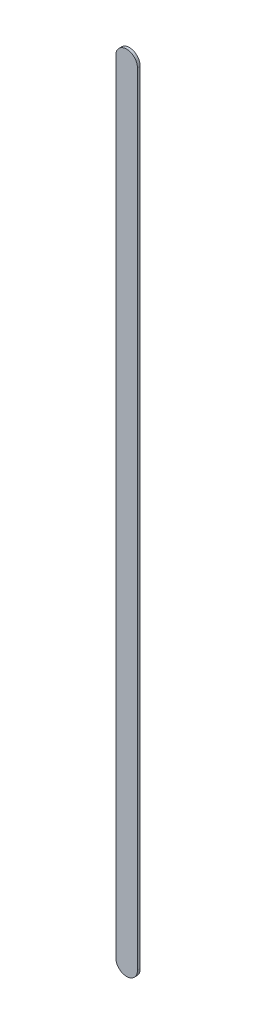
ISO-10303-21;
HEADER;
FILE_DESCRIPTION(('STEP AP214'),'2;1');
FILE_NAME('part.step','',(''),(''),'','','');
FILE_SCHEMA(('AUTOMOTIVE_DESIGN { 1 0 10303 214 1 1 1 1 }'));
ENDSEC;
DATA;
#1=APPLICATION_CONTEXT('core data for automotive mechanical design processes');
#2=APPLICATION_PROTOCOL_DEFINITION('international standard','automotive_design',2000,#1);
#3=PRODUCT_CONTEXT('',#1,'mechanical');
#4=PRODUCT('Part','Part','',(#3));
#5=PRODUCT_RELATED_PRODUCT_CATEGORY('part','',(#4));
#6=PRODUCT_DEFINITION_FORMATION('','',#4);
#7=PRODUCT_DEFINITION_CONTEXT('part definition',#1,'design');
#8=PRODUCT_DEFINITION('design','',#6,#7);
#9=PRODUCT_DEFINITION_SHAPE('','',#8);
#10=(LENGTH_UNIT() NAMED_UNIT(*) SI_UNIT(.MILLI.,.METRE.));
#11=(NAMED_UNIT(*) PLANE_ANGLE_UNIT() SI_UNIT($,.RADIAN.));
#12=(NAMED_UNIT(*) SI_UNIT($,.STERADIAN.) SOLID_ANGLE_UNIT());
#13=UNCERTAINTY_MEASURE_WITH_UNIT(LENGTH_MEASURE(1.E-05),#10,'distance_accuracy_value','');
#14=(GEOMETRIC_REPRESENTATION_CONTEXT(3) GLOBAL_UNCERTAINTY_ASSIGNED_CONTEXT((#13)) GLOBAL_UNIT_ASSIGNED_CONTEXT((#10,
#11,#12)) REPRESENTATION_CONTEXT('',''));
#15=CARTESIAN_POINT('',(0.,0.,0.));
#16=DIRECTION('',(0.,0.,1.));
#17=DIRECTION('',(1.,0.,0.));
#18=AXIS2_PLACEMENT_3D('',#15,#16,#17);
#19=CARTESIAN_POINT('',(6.775100097656,53.686499023437,1.1723000001));
#20=DIRECTION('',(0.,0.,1.));
#21=DIRECTION('',(1.,0.,0.));
#22=AXIS2_PLACEMENT_3D('',#19,#20,#21);
#23=PLANE('',#22);
#24=CARTESIAN_POINT('',(6.775100097656,51.886499023437,1.1723000001));
#25=DIRECTION('',(0.,0.,-1.));
#26=DIRECTION('',(1.,0.,0.));
#27=AXIS2_PLACEMENT_3D('',#24,#25,#26);
#28=CIRCLE('',#27,0.05);
#29=CARTESIAN_POINT('',(6.825100097656,51.886499023437,1.1723000001));
#30=VERTEX_POINT('',#29);
#31=CARTESIAN_POINT('',(6.725100097656,51.886499023437,1.1723000001));
#32=VERTEX_POINT('',#31);
#33=EDGE_CURVE('E105',#30,#32,#28,.T.);
#34=ORIENTED_EDGE('',*,*,#33,.F.);
#35=DIRECTION('',(0.,1.,0.));
#36=VECTOR('',#35,1.);
#37=CARTESIAN_POINT('',(6.825100097656,55.486499023437,1.1723000001));
#38=LINE('',#37,#36);
#39=CARTESIAN_POINT('',(6.825100097656,55.486499023437,1.1723000001));
#40=VERTEX_POINT('',#39);
#41=EDGE_CURVE('E103',#30,#40,#38,.T.);
#42=ORIENTED_EDGE('',*,*,#41,.T.);
#43=CARTESIAN_POINT('',(6.775100097656,55.486499023437,1.1723000001));
#44=DIRECTION('',(0.,0.,1.));
#45=DIRECTION('',(1.,0.,0.));
#46=AXIS2_PLACEMENT_3D('',#43,#44,#45);
#47=CIRCLE('',#46,0.05);
#48=CARTESIAN_POINT('',(6.725100097656,55.486499023437,1.1723000001));
#49=VERTEX_POINT('',#48);
#50=EDGE_CURVE('E71',#40,#49,#47,.T.);
#51=ORIENTED_EDGE('',*,*,#50,.T.);
#52=DIRECTION('',(0.,-1.,0.));
#53=VECTOR('',#52,1.);
#54=CARTESIAN_POINT('',(6.725100097656,51.886499023437,1.1723000001));
#55=LINE('',#54,#53);
#56=EDGE_CURVE('E11',#49,#32,#55,.T.);
#57=ORIENTED_EDGE('',*,*,#56,.T.);
#58=EDGE_LOOP('',(#34,#42,#51,#57));
#59=FACE_BOUND('',#58,.T.);
#60=ADVANCED_FACE('F17',(#59),#23,.T.);
#61=CARTESIAN_POINT('',(6.725100097656,51.886499023437,1.1596000001));
#62=DIRECTION('',(1.,0.,0.));
#63=DIRECTION('',(0.,1.,0.));
#64=AXIS2_PLACEMENT_3D('',#61,#62,#63);
#65=PLANE('',#64);
#66=DIRECTION('',(0.,0.,1.));
#67=VECTOR('',#66,1.);
#68=CARTESIAN_POINT('',(6.725100097656,55.486499023437,1.1596000001));
#69=LINE('',#68,#67);
#70=CARTESIAN_POINT('',(6.725100097656,55.486499023437,1.1596000001));
#71=VERTEX_POINT('',#70);
#72=EDGE_CURVE('E86',#71,#49,#69,.T.);
#73=ORIENTED_EDGE('',*,*,#72,.F.);
#74=DIRECTION('',(0.,-1.,0.));
#75=VECTOR('',#74,1.);
#76=CARTESIAN_POINT('',(6.725100097656,53.686499023437,1.1596000001));
#77=LINE('',#76,#75);
#78=CARTESIAN_POINT('',(6.725100097656,51.886499023437,1.1596000001));
#79=VERTEX_POINT('',#78);
#80=EDGE_CURVE('E84',#71,#79,#77,.T.);
#81=ORIENTED_EDGE('',*,*,#80,.T.);
#82=DIRECTION('',(0.,0.,-1.));
#83=VECTOR('',#82,1.);
#84=CARTESIAN_POINT('',(6.725100097656,51.886499023437,1.1596000001));
#85=LINE('',#84,#83);
#86=EDGE_CURVE('E20',#32,#79,#85,.T.);
#87=ORIENTED_EDGE('',*,*,#86,.F.);
#88=ORIENTED_EDGE('',*,*,#56,.F.);
#89=EDGE_LOOP('',(#73,#81,#87,#88));
#90=FACE_BOUND('',#89,.T.);
#91=ADVANCED_FACE('F121',(#90),#65,.F.);
#92=CARTESIAN_POINT('',(6.775100097656,51.886499023437,1.1596000001));
#93=DIRECTION('',(0.,0.,1.));
#94=DIRECTION('',(1.,0.,0.));
#95=AXIS2_PLACEMENT_3D('',#92,#93,#94);
#96=CYLINDRICAL_SURFACE('',#95,0.05);
#97=CARTESIAN_POINT('',(6.775100097656,51.886499023437,1.1596000001));
#98=DIRECTION('',(0.,0.,1.));
#99=DIRECTION('',(1.,0.,0.));
#100=AXIS2_PLACEMENT_3D('',#97,#98,#99);
#101=CIRCLE('',#100,0.05);
#102=CARTESIAN_POINT('',(6.825100097656,51.886499023437,1.1596000001));
#103=VERTEX_POINT('',#102);
#104=EDGE_CURVE('E92',#79,#103,#101,.T.);
#105=ORIENTED_EDGE('',*,*,#104,.T.);
#106=DIRECTION('',(0.,0.,1.));
#107=VECTOR('',#106,1.);
#108=CARTESIAN_POINT('',(6.825100097656,51.886499023437,1.1596000001));
#109=LINE('',#108,#107);
#110=EDGE_CURVE('E76',#103,#30,#109,.T.);
#111=ORIENTED_EDGE('',*,*,#110,.T.);
#112=ORIENTED_EDGE('',*,*,#33,.T.);
#113=ORIENTED_EDGE('',*,*,#86,.T.);
#114=EDGE_LOOP('',(#105,#111,#112,#113));
#115=FACE_BOUND('',#114,.T.);
#116=ADVANCED_FACE('F122',(#115),#96,.T.);
#117=CARTESIAN_POINT('',(6.825100097656,55.486499023437,1.1596000001));
#118=DIRECTION('',(-1.,0.,0.));
#119=DIRECTION('',(0.,0.,1.));
#120=AXIS2_PLACEMENT_3D('',#117,#118,#119);
#121=PLANE('',#120);
#122=ORIENTED_EDGE('',*,*,#110,.F.);
#123=DIRECTION('',(0.,1.,0.));
#124=VECTOR('',#123,1.);
#125=CARTESIAN_POINT('',(6.825100097656,53.686499023437,1.1596000001));
#126=LINE('',#125,#124);
#127=CARTESIAN_POINT('',(6.825100097656,55.486499023437,1.1596000001));
#128=VERTEX_POINT('',#127);
#129=EDGE_CURVE('E82',#103,#128,#126,.T.);
#130=ORIENTED_EDGE('',*,*,#129,.T.);
#131=DIRECTION('',(0.,0.,-1.));
#132=VECTOR('',#131,1.);
#133=CARTESIAN_POINT('',(6.825100097656,55.486499023437,1.1596000001));
#134=LINE('',#133,#132);
#135=EDGE_CURVE('E65',#40,#128,#134,.T.);
#136=ORIENTED_EDGE('',*,*,#135,.F.);
#137=ORIENTED_EDGE('',*,*,#41,.F.);
#138=EDGE_LOOP('',(#122,#130,#136,#137));
#139=FACE_BOUND('',#138,.T.);
#140=ADVANCED_FACE('F88',(#139),#121,.F.);
#141=CARTESIAN_POINT('',(6.775100097656,55.486499023437,1.1596000001));
#142=DIRECTION('',(0.,0.,1.));
#143=DIRECTION('',(1.,0.,0.));
#144=AXIS2_PLACEMENT_3D('',#141,#142,#143);
#145=CYLINDRICAL_SURFACE('',#144,0.05);
#146=CARTESIAN_POINT('',(6.775100097656,55.486499023437,1.1596000001));
#147=DIRECTION('',(0.,0.,1.));
#148=DIRECTION('',(1.,0.,0.));
#149=AXIS2_PLACEMENT_3D('',#146,#147,#148);
#150=CIRCLE('',#149,0.05);
#151=EDGE_CURVE('E69',#128,#71,#150,.T.);
#152=ORIENTED_EDGE('',*,*,#151,.T.);
#153=ORIENTED_EDGE('',*,*,#72,.T.);
#154=ORIENTED_EDGE('',*,*,#50,.F.);
#155=ORIENTED_EDGE('',*,*,#135,.T.);
#156=EDGE_LOOP('',(#152,#153,#154,#155));
#157=FACE_BOUND('',#156,.T.);
#158=ADVANCED_FACE('F67',(#157),#145,.T.);
#159=CARTESIAN_POINT('',(6.775100097656,53.686499023437,1.1596000001));
#160=DIRECTION('',(0.,0.,1.));
#161=DIRECTION('',(1.,0.,0.));
#162=AXIS2_PLACEMENT_3D('',#159,#160,#161);
#163=PLANE('',#162);
#164=ORIENTED_EDGE('',*,*,#129,.F.);
#165=ORIENTED_EDGE('',*,*,#104,.F.);
#166=ORIENTED_EDGE('',*,*,#80,.F.);
#167=ORIENTED_EDGE('',*,*,#151,.F.);
#168=EDGE_LOOP('',(#164,#165,#166,#167));
#169=FACE_BOUND('',#168,.T.);
#170=ADVANCED_FACE('F80',(#169),#163,.F.);
#171=CLOSED_SHELL('',(#60,#91,#116,#140,#158,#170));
#172=MANIFOLD_SOLID_BREP('B1',#171);
#173=ADVANCED_BREP_SHAPE_REPRESENTATION('',(#18,#172),#14);
#174=SHAPE_DEFINITION_REPRESENTATION(#9,#173);
ENDSEC;
END-ISO-10303-21;
